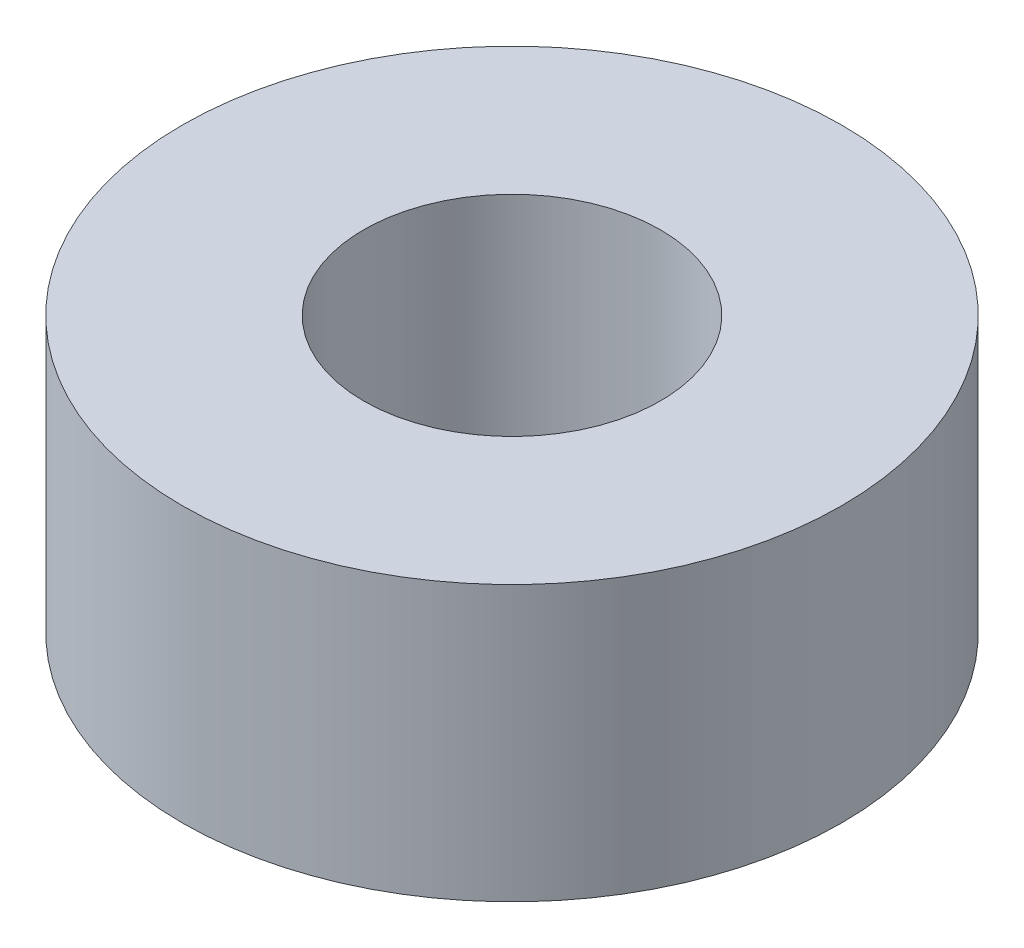
ISO-10303-21;
HEADER;
FILE_DESCRIPTION(('STEP AP214'),'2;1');
FILE_NAME('part.step','',(''),(''),'','','');
FILE_SCHEMA(('AUTOMOTIVE_DESIGN { 1 0 10303 214 1 1 1 1 }'));
ENDSEC;
DATA;
#1=APPLICATION_CONTEXT('core data for automotive mechanical design processes');
#2=APPLICATION_PROTOCOL_DEFINITION('international standard','automotive_design',2000,#1);
#3=PRODUCT_CONTEXT('',#1,'mechanical');
#4=PRODUCT('Part','Part','',(#3));
#5=PRODUCT_RELATED_PRODUCT_CATEGORY('part','',(#4));
#6=PRODUCT_DEFINITION_FORMATION('','',#4);
#7=PRODUCT_DEFINITION_CONTEXT('part definition',#1,'design');
#8=PRODUCT_DEFINITION('design','',#6,#7);
#9=PRODUCT_DEFINITION_SHAPE('','',#8);
#10=(LENGTH_UNIT() NAMED_UNIT(*) SI_UNIT(.MILLI.,.METRE.));
#11=(NAMED_UNIT(*) PLANE_ANGLE_UNIT() SI_UNIT($,.RADIAN.));
#12=(NAMED_UNIT(*) SI_UNIT($,.STERADIAN.) SOLID_ANGLE_UNIT());
#13=UNCERTAINTY_MEASURE_WITH_UNIT(LENGTH_MEASURE(1.E-05),#10,'distance_accuracy_value','');
#14=(GEOMETRIC_REPRESENTATION_CONTEXT(3) GLOBAL_UNCERTAINTY_ASSIGNED_CONTEXT((#13)) GLOBAL_UNIT_ASSIGNED_CONTEXT((#10,
#11,#12)) REPRESENTATION_CONTEXT('',''));
#15=CARTESIAN_POINT('',(0.,0.,0.));
#16=DIRECTION('',(0.,0.,1.));
#17=DIRECTION('',(1.,0.,0.));
#18=AXIS2_PLACEMENT_3D('',#15,#16,#17);
#19=CARTESIAN_POINT('',(0.,2.5,0.));
#20=DIRECTION('',(0.,1.,0.));
#21=DIRECTION('',(0.,0.,1.));
#22=AXIS2_PLACEMENT_3D('',#19,#20,#21);
#23=PLANE('',#22);
#24=CARTESIAN_POINT('',(0.,2.5,0.));
#25=DIRECTION('',(0.,1.,0.));
#26=DIRECTION('',(0.,0.,1.));
#27=AXIS2_PLACEMENT_3D('',#24,#25,#26);
#28=CIRCLE('',#27,3.);
#29=CARTESIAN_POINT('',(0.,2.5,3.));
#30=VERTEX_POINT('',#29);
#31=EDGE_CURVE('E10',#30,#30,#28,.T.);
#32=ORIENTED_EDGE('',*,*,#31,.T.);
#33=EDGE_LOOP('',(#32));
#34=FACE_BOUND('',#33,.T.);
#35=CARTESIAN_POINT('',(0.,2.5,0.));
#36=DIRECTION('',(0.,1.,0.));
#37=DIRECTION('',(0.,0.,1.));
#38=AXIS2_PLACEMENT_3D('',#35,#36,#37);
#39=CIRCLE('',#38,1.35);
#40=CARTESIAN_POINT('',(0.,2.5,1.35));
#41=VERTEX_POINT('',#40);
#42=EDGE_CURVE('E43',#41,#41,#39,.T.);
#43=ORIENTED_EDGE('',*,*,#42,.F.);
#44=EDGE_LOOP('',(#43));
#45=FACE_BOUND('',#44,.T.);
#46=ADVANCED_FACE('F32',(#34,#45),#23,.T.);
#47=CARTESIAN_POINT('',(0.,0.,0.));
#48=DIRECTION('',(0.,1.,0.));
#49=DIRECTION('',(0.,0.,1.));
#50=AXIS2_PLACEMENT_3D('',#47,#48,#49);
#51=PLANE('',#50);
#52=CARTESIAN_POINT('',(0.,0.,0.));
#53=DIRECTION('',(0.,1.,0.));
#54=DIRECTION('',(0.,0.,1.));
#55=AXIS2_PLACEMENT_3D('',#52,#53,#54);
#56=CIRCLE('',#55,3.);
#57=CARTESIAN_POINT('',(0.,0.,3.));
#58=VERTEX_POINT('',#57);
#59=EDGE_CURVE('E36',#58,#58,#56,.T.);
#60=ORIENTED_EDGE('',*,*,#59,.F.);
#61=EDGE_LOOP('',(#60));
#62=FACE_BOUND('',#61,.T.);
#63=CARTESIAN_POINT('',(0.,0.,0.));
#64=DIRECTION('',(0.,1.,0.));
#65=DIRECTION('',(0.,0.,1.));
#66=AXIS2_PLACEMENT_3D('',#63,#64,#65);
#67=CIRCLE('',#66,1.35);
#68=CARTESIAN_POINT('',(0.,0.,1.35));
#69=VERTEX_POINT('',#68);
#70=EDGE_CURVE('E45',#69,#69,#67,.T.);
#71=ORIENTED_EDGE('',*,*,#70,.T.);
#72=EDGE_LOOP('',(#71));
#73=FACE_BOUND('',#72,.T.);
#74=ADVANCED_FACE('F55',(#62,#73),#51,.F.);
#75=CARTESIAN_POINT('',(0.,2.5,0.));
#76=DIRECTION('',(0.,-1.,0.));
#77=DIRECTION('',(0.,0.,-1.));
#78=AXIS2_PLACEMENT_3D('',#75,#76,#77);
#79=CYLINDRICAL_SURFACE('',#78,3.);
#80=ORIENTED_EDGE('',*,*,#31,.F.);
#81=EDGE_LOOP('',(#80));
#82=FACE_BOUND('',#81,.T.);
#83=ORIENTED_EDGE('',*,*,#59,.T.);
#84=EDGE_LOOP('',(#83));
#85=FACE_BOUND('',#84,.T.);
#86=ADVANCED_FACE('F34',(#82,#85),#79,.T.);
#87=CARTESIAN_POINT('',(0.,2.5,0.));
#88=DIRECTION('',(0.,-1.,0.));
#89=DIRECTION('',(0.,0.,-1.));
#90=AXIS2_PLACEMENT_3D('',#87,#88,#89);
#91=CYLINDRICAL_SURFACE('',#90,1.35);
#92=ORIENTED_EDGE('',*,*,#42,.T.);
#93=EDGE_LOOP('',(#92));
#94=FACE_BOUND('',#93,.T.);
#95=ORIENTED_EDGE('',*,*,#70,.F.);
#96=EDGE_LOOP('',(#95));
#97=FACE_BOUND('',#96,.T.);
#98=ADVANCED_FACE('F51',(#94,#97),#91,.F.);
#99=CLOSED_SHELL('',(#46,#74,#86,#98));
#100=MANIFOLD_SOLID_BREP('B2',#99);
#101=ADVANCED_BREP_SHAPE_REPRESENTATION('',(#18,#100),#14);
#102=SHAPE_DEFINITION_REPRESENTATION(#9,#101);
ENDSEC;
END-ISO-10303-21;
